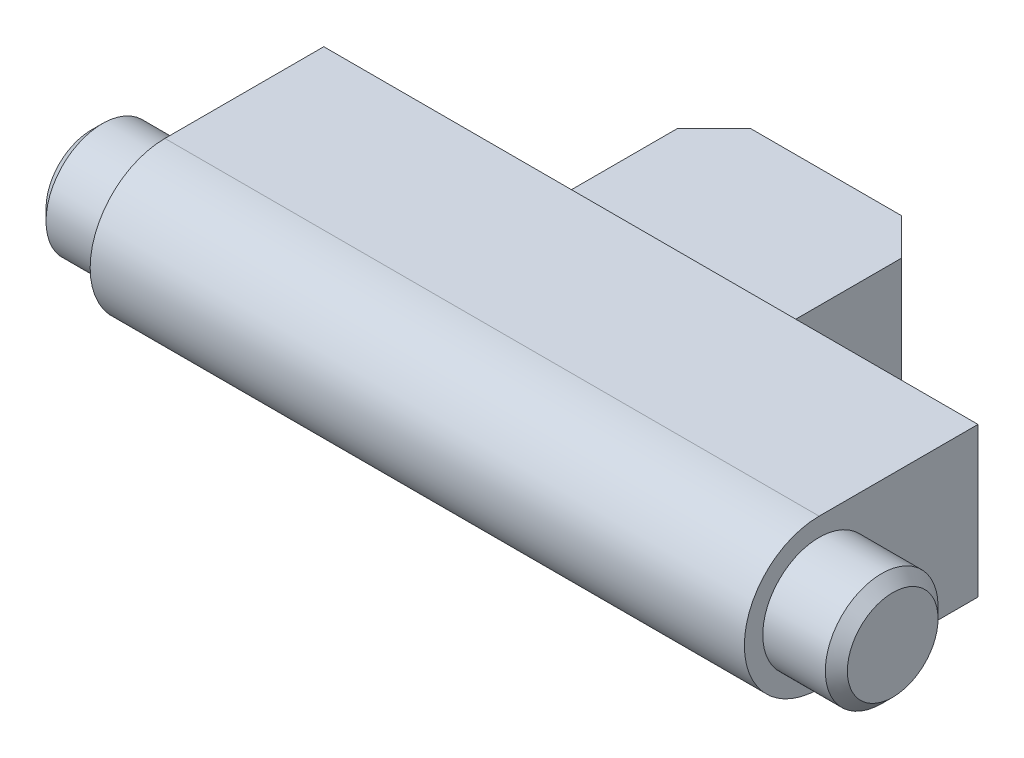
ISO-10303-21;
HEADER;
FILE_DESCRIPTION(('STEP AP214'),'2;1');
FILE_NAME('part.step','',(''),(''),'','','');
FILE_SCHEMA(('AUTOMOTIVE_DESIGN { 1 0 10303 214 1 1 1 1 }'));
ENDSEC;
DATA;
#1=APPLICATION_CONTEXT('core data for automotive mechanical design processes');
#2=APPLICATION_PROTOCOL_DEFINITION('international standard','automotive_design',2000,#1);
#3=PRODUCT_CONTEXT('',#1,'mechanical');
#4=PRODUCT('Part','Part','',(#3));
#5=PRODUCT_RELATED_PRODUCT_CATEGORY('part','',(#4));
#6=PRODUCT_DEFINITION_FORMATION('','',#4);
#7=PRODUCT_DEFINITION_CONTEXT('part definition',#1,'design');
#8=PRODUCT_DEFINITION('design','',#6,#7);
#9=PRODUCT_DEFINITION_SHAPE('','',#8);
#10=(LENGTH_UNIT() NAMED_UNIT(*) SI_UNIT(.MILLI.,.METRE.));
#11=(NAMED_UNIT(*) PLANE_ANGLE_UNIT() SI_UNIT($,.RADIAN.));
#12=(NAMED_UNIT(*) SI_UNIT($,.STERADIAN.) SOLID_ANGLE_UNIT());
#13=UNCERTAINTY_MEASURE_WITH_UNIT(LENGTH_MEASURE(1.E-05),#10,'distance_accuracy_value','');
#14=(GEOMETRIC_REPRESENTATION_CONTEXT(3) GLOBAL_UNCERTAINTY_ASSIGNED_CONTEXT((#13)) GLOBAL_UNIT_ASSIGNED_CONTEXT((#10,
#11,#12)) REPRESENTATION_CONTEXT('',''));
#15=CARTESIAN_POINT('',(0.,0.,0.));
#16=DIRECTION('',(0.,0.,1.));
#17=DIRECTION('',(1.,0.,0.));
#18=AXIS2_PLACEMENT_3D('',#15,#16,#17);
#19=CARTESIAN_POINT('',(0.,0.,0.));
#20=DIRECTION('',(0.,0.,-1.));
#21=DIRECTION('',(-1.,0.,0.));
#22=AXIS2_PLACEMENT_3D('',#19,#20,#21);
#23=PLANE('',#22);
#24=DIRECTION('',(0.,1.,0.));
#25=VECTOR('',#24,1.);
#26=CARTESIAN_POINT('',(-3507.0194796416,498.462300000025,0.));
#27=LINE('',#26,#25);
#28=CARTESIAN_POINT('',(-3507.0194796416,498.335300000025,0.));
#29=VERTEX_POINT('',#28);
#30=CARTESIAN_POINT('',(-3507.0194796416,501.510300000025,0.));
#31=VERTEX_POINT('',#30);
#32=EDGE_CURVE('E123',#29,#31,#27,.T.);
#33=ORIENTED_EDGE('',*,*,#32,.F.);
#34=DIRECTION('',(1.,0.,0.));
#35=VECTOR('',#34,1.);
#36=CARTESIAN_POINT('',(-3512.8614796416,498.335300000025,0.));
#37=LINE('',#36,#35);
#38=CARTESIAN_POINT('',(-3512.8614796416,498.335300000025,0.));
#39=VERTEX_POINT('',#38);
#40=EDGE_CURVE('E136',#39,#29,#37,.T.);
#41=ORIENTED_EDGE('',*,*,#40,.F.);
#42=DIRECTION('',(0.,-1.,0.));
#43=VECTOR('',#42,1.);
#44=CARTESIAN_POINT('',(-3512.8614796416,498.335300000025,0.));
#45=LINE('',#44,#43);
#46=CARTESIAN_POINT('',(-3512.8614796416,502.399300000025,0.));
#47=VERTEX_POINT('',#46);
#48=EDGE_CURVE('E137',#47,#39,#45,.T.);
#49=ORIENTED_EDGE('',*,*,#48,.F.);
#50=DIRECTION('',(-1.,0.,0.));
#51=VECTOR('',#50,1.);
#52=CARTESIAN_POINT('',(-3512.8614796416,502.399300000025,0.));
#53=LINE('',#52,#51);
#54=CARTESIAN_POINT('',(-3495.0814796416,502.399300000025,0.));
#55=VERTEX_POINT('',#54);
#56=EDGE_CURVE('E142',#55,#47,#53,.T.);
#57=ORIENTED_EDGE('',*,*,#56,.F.);
#58=DIRECTION('',(0.,1.,0.));
#59=VECTOR('',#58,1.);
#60=CARTESIAN_POINT('',(-3495.0814796416,498.335300000025,0.));
#61=LINE('',#60,#59);
#62=CARTESIAN_POINT('',(-3495.0814796416,498.335300000025,0.));
#63=VERTEX_POINT('',#62);
#64=EDGE_CURVE('E135',#63,#55,#61,.T.);
#65=ORIENTED_EDGE('',*,*,#64,.F.);
#66=CARTESIAN_POINT('',(-3500.9234796416,498.335300000025,0.));
#67=VERTEX_POINT('',#66);
#68=EDGE_CURVE('E127',#67,#63,#37,.T.);
#69=ORIENTED_EDGE('',*,*,#68,.F.);
#70=DIRECTION('',(0.,-1.,0.));
#71=VECTOR('',#70,1.);
#72=CARTESIAN_POINT('',(-3500.9234796416,501.510300000025,0.));
#73=LINE('',#72,#71);
#74=CARTESIAN_POINT('',(-3500.9234796416,501.510300000025,0.));
#75=VERTEX_POINT('',#74);
#76=EDGE_CURVE('E113',#75,#67,#73,.T.);
#77=ORIENTED_EDGE('',*,*,#76,.F.);
#78=DIRECTION('',(1.,0.,0.));
#79=VECTOR('',#78,1.);
#80=CARTESIAN_POINT('',(-3507.0194796416,501.510300000025,0.));
#81=LINE('',#80,#79);
#82=EDGE_CURVE('E420',#31,#75,#81,.T.);
#83=ORIENTED_EDGE('',*,*,#82,.F.);
#84=EDGE_LOOP('',(#33,#41,#49,#57,#65,#69,#77,#83));
#85=FACE_BOUND('',#84,.T.);
#86=ADVANCED_FACE('F35',(#85),#23,.T.);
#87=CARTESIAN_POINT('',(-3512.8614796416,500.367300000025,4.31800000000002));
#88=DIRECTION('',(-1.,0.,0.));
#89=DIRECTION('',(0.,0.,1.));
#90=AXIS2_PLACEMENT_3D('',#87,#88,#89);
#91=CYLINDRICAL_SURFACE('',#90,2.03199999999996);
#92=DIRECTION('',(-1.,0.,0.));
#93=VECTOR('',#92,1.);
#94=CARTESIAN_POINT('',(-3512.8614796416,502.399300000025,4.31800000000002));
#95=LINE('',#94,#93);
#96=CARTESIAN_POINT('',(-3512.8614796416,502.399300000025,4.31800000000002));
#97=VERTEX_POINT('',#96);
#98=CARTESIAN_POINT('',(-3495.0814796416,502.399300000025,4.31800000000002));
#99=VERTEX_POINT('',#98);
#100=EDGE_CURVE('E153',#97,#99,#95,.F.);
#101=ORIENTED_EDGE('',*,*,#100,.F.);
#102=CARTESIAN_POINT('',(-3512.8614796416,500.367300000025,4.31800000000002));
#103=DIRECTION('',(1.,0.,0.));
#104=DIRECTION('',(0.,0.,-1.));
#105=AXIS2_PLACEMENT_3D('',#102,#103,#104);
#106=CIRCLE('',#105,2.03199999999996);
#107=CARTESIAN_POINT('',(-3512.8614796416,498.335300000025,4.31800000000008));
#108=VERTEX_POINT('',#107);
#109=EDGE_CURVE('E159',#108,#97,#106,.F.);
#110=ORIENTED_EDGE('',*,*,#109,.F.);
#111=DIRECTION('',(-1.,0.,0.));
#112=VECTOR('',#111,1.);
#113=CARTESIAN_POINT('',(-3512.8614796416,498.335300000025,4.31800000000002));
#114=LINE('',#113,#112);
#115=CARTESIAN_POINT('',(-3495.0814796416,498.335300000025,4.31800000000008));
#116=VERTEX_POINT('',#115);
#117=EDGE_CURVE('E156',#116,#108,#114,.T.);
#118=ORIENTED_EDGE('',*,*,#117,.F.);
#119=CARTESIAN_POINT('',(-3495.0814796416,500.367300000025,4.31800000000002));
#120=DIRECTION('',(-1.,0.,0.));
#121=DIRECTION('',(0.,0.,1.));
#122=AXIS2_PLACEMENT_3D('',#119,#120,#121);
#123=CIRCLE('',#122,2.03199999999996);
#124=EDGE_CURVE('E161',#99,#116,#123,.F.);
#125=ORIENTED_EDGE('',*,*,#124,.F.);
#126=EDGE_LOOP('',(#101,#110,#118,#125));
#127=FACE_BOUND('',#126,.T.);
#128=ADVANCED_FACE('F227',(#127),#91,.T.);
#129=CARTESIAN_POINT('',(-3495.0814796416,498.335300000025,6.35));
#130=DIRECTION('',(-1.,0.,0.));
#131=DIRECTION('',(0.,0.,1.));
#132=AXIS2_PLACEMENT_3D('',#129,#130,#131);
#133=PLANE('',#132);
#134=CARTESIAN_POINT('',(-3495.08147964159,500.367300000025,4.31800000000002));
#135=DIRECTION('',(-1.,0.,0.));
#136=DIRECTION('',(0.,-1.,0.));
#137=AXIS2_PLACEMENT_3D('',#134,#135,#136);
#138=CIRCLE('',#137,1.53199999999989);
#139=CARTESIAN_POINT('',(-3495.08147964159,498.835300000025,4.31800000000002));
#140=VERTEX_POINT('',#139);
#141=EDGE_CURVE('E207',#140,#140,#138,.T.);
#142=ORIENTED_EDGE('',*,*,#141,.T.);
#143=EDGE_LOOP('',(#142));
#144=FACE_BOUND('',#143,.T.);
#145=DIRECTION('',(0.,0.,-1.));
#146=VECTOR('',#145,1.);
#147=CARTESIAN_POINT('',(-3495.0814796416,502.399300000025,6.35));
#148=LINE('',#147,#146);
#149=EDGE_CURVE('E151',#99,#55,#148,.T.);
#150=ORIENTED_EDGE('',*,*,#149,.F.);
#151=ORIENTED_EDGE('',*,*,#124,.T.);
#152=DIRECTION('',(0.,0.,-1.));
#153=VECTOR('',#152,1.);
#154=CARTESIAN_POINT('',(-3495.0814796416,498.335300000025,6.35));
#155=LINE('',#154,#153);
#156=EDGE_CURVE('E140',#116,#63,#155,.T.);
#157=ORIENTED_EDGE('',*,*,#156,.T.);
#158=ORIENTED_EDGE('',*,*,#64,.T.);
#159=EDGE_LOOP('',(#150,#151,#157,#158));
#160=FACE_BOUND('',#159,.T.);
#161=ADVANCED_FACE('F229',(#144,#160),#133,.F.);
#162=CARTESIAN_POINT('',(-3512.8614796416,502.399300000025,6.35));
#163=DIRECTION('',(0.,-1.,0.));
#164=DIRECTION('',(0.,0.,-1.));
#165=AXIS2_PLACEMENT_3D('',#162,#163,#164);
#166=PLANE('',#165);
#167=DIRECTION('',(0.,0.,-1.));
#168=VECTOR('',#167,1.);
#169=CARTESIAN_POINT('',(-3512.8614796416,502.399300000025,6.35));
#170=LINE('',#169,#168);
#171=EDGE_CURVE('E149',#97,#47,#170,.T.);
#172=ORIENTED_EDGE('',*,*,#171,.F.);
#173=ORIENTED_EDGE('',*,*,#100,.T.);
#174=ORIENTED_EDGE('',*,*,#149,.T.);
#175=ORIENTED_EDGE('',*,*,#56,.T.);
#176=EDGE_LOOP('',(#172,#173,#174,#175));
#177=FACE_BOUND('',#176,.T.);
#178=ADVANCED_FACE('F218',(#177),#166,.F.);
#179=CARTESIAN_POINT('',(-3512.8614796416,498.335300000025,6.35));
#180=DIRECTION('',(1.,0.,0.));
#181=DIRECTION('',(0.,0.,-1.));
#182=AXIS2_PLACEMENT_3D('',#179,#180,#181);
#183=PLANE('',#182);
#184=CARTESIAN_POINT('',(-3512.8614796416,500.367300000025,4.31800000000002));
#185=DIRECTION('',(1.,0.,0.));
#186=DIRECTION('',(0.,0.,-1.));
#187=AXIS2_PLACEMENT_3D('',#184,#185,#186);
#188=CIRCLE('',#187,1.53199999999989);
#189=CARTESIAN_POINT('',(-3512.8614796416,500.367300000025,2.78600000000013));
#190=VERTEX_POINT('',#189);
#191=EDGE_CURVE('E163',#190,#190,#188,.F.);
#192=ORIENTED_EDGE('',*,*,#191,.F.);
#193=EDGE_LOOP('',(#192));
#194=FACE_BOUND('',#193,.T.);
#195=DIRECTION('',(0.,0.,-1.));
#196=VECTOR('',#195,1.);
#197=CARTESIAN_POINT('',(-3512.8614796416,498.335300000025,6.35));
#198=LINE('',#197,#196);
#199=EDGE_CURVE('E147',#108,#39,#198,.T.);
#200=ORIENTED_EDGE('',*,*,#199,.F.);
#201=ORIENTED_EDGE('',*,*,#109,.T.);
#202=ORIENTED_EDGE('',*,*,#171,.T.);
#203=ORIENTED_EDGE('',*,*,#48,.T.);
#204=EDGE_LOOP('',(#200,#201,#202,#203));
#205=FACE_BOUND('',#204,.T.);
#206=ADVANCED_FACE('F223',(#194,#205),#183,.F.);
#207=CARTESIAN_POINT('',(-3512.8614796416,498.335300000025,6.35));
#208=DIRECTION('',(0.,1.,0.));
#209=DIRECTION('',(0.,0.,1.));
#210=AXIS2_PLACEMENT_3D('',#207,#208,#209);
#211=PLANE('',#210);
#212=DIRECTION('',(0.,0.,1.));
#213=VECTOR('',#212,1.);
#214=CARTESIAN_POINT('',(-3507.0194796416,498.335300000025,0.));
#215=LINE('',#214,#213);
#216=CARTESIAN_POINT('',(-3507.0194796416,498.335300000025,-3.76249999999992));
#217=VERTEX_POINT('',#216);
#218=EDGE_CURVE('E129',#217,#29,#215,.T.);
#219=ORIENTED_EDGE('',*,*,#218,.F.);
#220=DIRECTION('',(0.707106781186481,0.,-0.707106781186614));
#221=VECTOR('',#220,1.);
#222=CARTESIAN_POINT('',(-3506.0194796416,498.335300000025,-4.7625));
#223=LINE('',#222,#221);
#224=CARTESIAN_POINT('',(-3506.0194796416,498.335300000025,-4.7625));
#225=VERTEX_POINT('',#224);
#226=EDGE_CURVE('E44',#217,#225,#223,.T.);
#227=ORIENTED_EDGE('',*,*,#226,.T.);
#228=DIRECTION('',(-1.,0.,0.));
#229=VECTOR('',#228,1.);
#230=CARTESIAN_POINT('',(-3507.0194796416,498.335300000025,-4.7625));
#231=LINE('',#230,#229);
#232=CARTESIAN_POINT('',(-3501.9234796416,498.335300000025,-4.7625));
#233=VERTEX_POINT('',#232);
#234=EDGE_CURVE('E191',#233,#225,#231,.T.);
#235=ORIENTED_EDGE('',*,*,#234,.F.);
#236=DIRECTION('',(0.707106781186481,0.,0.707106781186614));
#237=VECTOR('',#236,1.);
#238=CARTESIAN_POINT('',(-3501.9234796416,498.335300000025,-4.7625));
#239=LINE('',#238,#237);
#240=CARTESIAN_POINT('',(-3500.9234796416,498.335300000025,-3.76249999999992));
#241=VERTEX_POINT('',#240);
#242=EDGE_CURVE('E51',#233,#241,#239,.T.);
#243=ORIENTED_EDGE('',*,*,#242,.T.);
#244=DIRECTION('',(0.,0.,-1.));
#245=VECTOR('',#244,1.);
#246=CARTESIAN_POINT('',(-3500.9234796416,498.335300000025,-4.7625));
#247=LINE('',#246,#245);
#248=EDGE_CURVE('E115',#67,#241,#247,.T.);
#249=ORIENTED_EDGE('',*,*,#248,.F.);
#250=ORIENTED_EDGE('',*,*,#68,.T.);
#251=ORIENTED_EDGE('',*,*,#156,.F.);
#252=ORIENTED_EDGE('',*,*,#117,.T.);
#253=ORIENTED_EDGE('',*,*,#199,.T.);
#254=ORIENTED_EDGE('',*,*,#40,.T.);
#255=EDGE_LOOP('',(#219,#227,#235,#243,#249,#250,#251,#252,#253,#254));
#256=FACE_BOUND('',#255,.T.);
#257=ADVANCED_FACE('F125',(#256),#211,.F.);
#258=CARTESIAN_POINT('',(-3514.86147964161,500.367300000025,4.31800000000002));
#259=DIRECTION('',(1.,0.,0.));
#260=DIRECTION('',(0.,1.,0.));
#261=AXIS2_PLACEMENT_3D('',#258,#259,#260);
#262=CYLINDRICAL_SURFACE('',#261,1.53199999999989);
#263=CARTESIAN_POINT('',(-3514.56147964161,500.367300000025,4.31800000000002));
#264=DIRECTION('',(-1.,0.,0.));
#265=DIRECTION('',(0.,0.,1.));
#266=AXIS2_PLACEMENT_3D('',#263,#264,#265);
#267=CIRCLE('',#266,1.53199999999989);
#268=CARTESIAN_POINT('',(-3514.56147964161,500.367300000025,5.84999999999991));
#269=VERTEX_POINT('',#268);
#270=EDGE_CURVE('E169',#269,#269,#267,.F.);
#271=ORIENTED_EDGE('',*,*,#270,.T.);
#272=EDGE_LOOP('',(#271));
#273=FACE_BOUND('',#272,.T.);
#274=ORIENTED_EDGE('',*,*,#191,.T.);
#275=EDGE_LOOP('',(#274));
#276=FACE_BOUND('',#275,.T.);
#277=ADVANCED_FACE('F245',(#273,#276),#262,.T.);
#278=CARTESIAN_POINT('',(-3514.86147964161,500.367300000025,4.31800000000002));
#279=DIRECTION('',(-1.,0.,0.));
#280=DIRECTION('',(0.,-1.,0.));
#281=AXIS2_PLACEMENT_3D('',#278,#279,#280);
#282=PLANE('',#281);
#283=CARTESIAN_POINT('',(-3514.86147964161,500.367300000025,4.31800000000002));
#284=DIRECTION('',(-1.,0.,0.));
#285=DIRECTION('',(0.,-1.,0.));
#286=AXIS2_PLACEMENT_3D('',#283,#284,#285);
#287=CIRCLE('',#286,1.2319999999994);
#288=CARTESIAN_POINT('',(-3514.86147964161,499.135300000025,4.31800000000002));
#289=VERTEX_POINT('',#288);
#290=EDGE_CURVE('E166',#289,#289,#287,.T.);
#291=ORIENTED_EDGE('',*,*,#290,.T.);
#292=EDGE_LOOP('',(#291));
#293=FACE_BOUND('',#292,.T.);
#294=ADVANCED_FACE('F256',(#293),#282,.T.);
#295=CARTESIAN_POINT('',(-3514.86147964161,500.367300000025,4.31800000000002));
#296=DIRECTION('',(1.,0.,0.));
#297=DIRECTION('',(0.,0.,-1.));
#298=AXIS2_PLACEMENT_3D('',#295,#296,#297);
#299=CONICAL_SURFACE('',#298,1.23199999999934,0.785398163397306);
#300=ORIENTED_EDGE('',*,*,#270,.F.);
#301=EDGE_LOOP('',(#300));
#302=FACE_BOUND('',#301,.T.);
#303=ORIENTED_EDGE('',*,*,#290,.F.);
#304=EDGE_LOOP('',(#303));
#305=FACE_BOUND('',#304,.T.);
#306=ADVANCED_FACE('F261',(#302,#305),#299,.T.);
#307=CARTESIAN_POINT('',(-3493.08147964159,500.367300000025,4.31800000000002));
#308=DIRECTION('',(-1.,0.,0.));
#309=DIRECTION('',(0.,-1.,0.));
#310=AXIS2_PLACEMENT_3D('',#307,#308,#309);
#311=CYLINDRICAL_SURFACE('',#310,1.53199999999989);
#312=CARTESIAN_POINT('',(-3493.38147964159,500.367300000025,4.31800000000002));
#313=DIRECTION('',(1.,0.,0.));
#314=DIRECTION('',(0.,0.,-1.));
#315=AXIS2_PLACEMENT_3D('',#312,#313,#314);
#316=CIRCLE('',#315,1.53199999999989);
#317=CARTESIAN_POINT('',(-3493.38147964159,500.367300000025,2.78600000000013));
#318=VERTEX_POINT('',#317);
#319=EDGE_CURVE('E172',#318,#318,#316,.F.);
#320=ORIENTED_EDGE('',*,*,#319,.T.);
#321=EDGE_LOOP('',(#320));
#322=FACE_BOUND('',#321,.T.);
#323=ORIENTED_EDGE('',*,*,#141,.F.);
#324=EDGE_LOOP('',(#323));
#325=FACE_BOUND('',#324,.T.);
#326=ADVANCED_FACE('F267',(#322,#325),#311,.T.);
#327=CARTESIAN_POINT('',(-3493.08147964159,500.367300000025,4.31800000000002));
#328=DIRECTION('',(1.,0.,0.));
#329=DIRECTION('',(0.,-1.,0.));
#330=AXIS2_PLACEMENT_3D('',#327,#328,#329);
#331=PLANE('',#330);
#332=CARTESIAN_POINT('',(-3493.08147964159,500.367300000025,4.31800000000002));
#333=DIRECTION('',(1.,0.,0.));
#334=DIRECTION('',(0.,1.,0.));
#335=AXIS2_PLACEMENT_3D('',#332,#333,#334);
#336=CIRCLE('',#335,1.23199999999962);
#337=CARTESIAN_POINT('',(-3493.08147964159,501.599300000024,4.31800000000002));
#338=VERTEX_POINT('',#337);
#339=EDGE_CURVE('E175',#338,#338,#336,.T.);
#340=ORIENTED_EDGE('',*,*,#339,.T.);
#341=EDGE_LOOP('',(#340));
#342=FACE_BOUND('',#341,.T.);
#343=ADVANCED_FACE('F273',(#342),#331,.T.);
#344=CARTESIAN_POINT('',(-3493.38147964159,500.367300000025,4.31800000000002));
#345=DIRECTION('',(-1.,0.,0.));
#346=DIRECTION('',(0.,0.,1.));
#347=AXIS2_PLACEMENT_3D('',#344,#345,#346);
#348=CONICAL_SURFACE('',#347,1.53199999999989,0.785398163397676);
#349=ORIENTED_EDGE('',*,*,#339,.F.);
#350=EDGE_LOOP('',(#349));
#351=FACE_BOUND('',#350,.T.);
#352=ORIENTED_EDGE('',*,*,#319,.F.);
#353=EDGE_LOOP('',(#352));
#354=FACE_BOUND('',#353,.T.);
#355=ADVANCED_FACE('F282',(#351,#354),#348,.T.);
#356=CARTESIAN_POINT('',(-3500.9234796416,501.510300000025,-4.7625));
#357=DIRECTION('',(-1.,0.,0.));
#358=DIRECTION('',(0.,0.,1.));
#359=AXIS2_PLACEMENT_3D('',#356,#357,#358);
#360=PLANE('',#359);
#361=ORIENTED_EDGE('',*,*,#248,.T.);
#362=DIRECTION('',(0.,1.,0.));
#363=VECTOR('',#362,1.);
#364=CARTESIAN_POINT('',(-3500.9234796416,501.510300000025,-3.76249999999992));
#365=LINE('',#364,#363);
#366=CARTESIAN_POINT('',(-3500.9234796416,501.510300000025,-3.76249999999992));
#367=VERTEX_POINT('',#366);
#368=EDGE_CURVE('E11',#241,#367,#365,.T.);
#369=ORIENTED_EDGE('',*,*,#368,.T.);
#370=DIRECTION('',(0.,0.,1.));
#371=VECTOR('',#370,1.);
#372=CARTESIAN_POINT('',(-3500.9234796416,501.510300000025,-4.7625));
#373=LINE('',#372,#371);
#374=EDGE_CURVE('E118',#367,#75,#373,.T.);
#375=ORIENTED_EDGE('',*,*,#374,.T.);
#376=ORIENTED_EDGE('',*,*,#76,.T.);
#377=EDGE_LOOP('',(#361,#369,#375,#376));
#378=FACE_BOUND('',#377,.T.);
#379=ADVANCED_FACE('F114',(#378),#360,.F.);
#380=CARTESIAN_POINT('',(-3507.0194796416,498.462300000025,-4.7625));
#381=DIRECTION('',(1.,0.,0.));
#382=DIRECTION('',(0.,0.,-1.));
#383=AXIS2_PLACEMENT_3D('',#380,#381,#382);
#384=PLANE('',#383);
#385=DIRECTION('',(0.,0.,1.));
#386=VECTOR('',#385,1.);
#387=CARTESIAN_POINT('',(-3507.0194796416,501.510300000025,-4.7625));
#388=LINE('',#387,#386);
#389=CARTESIAN_POINT('',(-3507.0194796416,501.510300000025,-3.76249999999992));
#390=VERTEX_POINT('',#389);
#391=EDGE_CURVE('E203',#390,#31,#388,.T.);
#392=ORIENTED_EDGE('',*,*,#391,.F.);
#393=DIRECTION('',(0.,-1.,0.));
#394=VECTOR('',#393,1.);
#395=CARTESIAN_POINT('',(-3507.0194796416,498.335300000025,-3.76249999999992));
#396=LINE('',#395,#394);
#397=EDGE_CURVE('E59',#390,#217,#396,.T.);
#398=ORIENTED_EDGE('',*,*,#397,.T.);
#399=ORIENTED_EDGE('',*,*,#218,.T.);
#400=ORIENTED_EDGE('',*,*,#32,.T.);
#401=EDGE_LOOP('',(#392,#398,#399,#400));
#402=FACE_BOUND('',#401,.T.);
#403=ADVANCED_FACE('F206',(#402),#384,.F.);
#404=CARTESIAN_POINT('',(-3507.0194796416,501.510300000025,-4.7625));
#405=DIRECTION('',(0.,-1.,0.));
#406=DIRECTION('',(0.,0.,-1.));
#407=AXIS2_PLACEMENT_3D('',#404,#405,#406);
#408=PLANE('',#407);
#409=DIRECTION('',(1.,0.,0.));
#410=VECTOR('',#409,1.);
#411=CARTESIAN_POINT('',(-3507.0194796416,501.510300000025,-4.7625));
#412=LINE('',#411,#410);
#413=CARTESIAN_POINT('',(-3506.0194796416,501.510300000025,-4.7625));
#414=VERTEX_POINT('',#413);
#415=CARTESIAN_POINT('',(-3501.9234796416,501.510300000025,-4.7625));
#416=VERTEX_POINT('',#415);
#417=EDGE_CURVE('E204',#414,#416,#412,.T.);
#418=ORIENTED_EDGE('',*,*,#417,.F.);
#419=DIRECTION('',(-0.707106781186481,0.,0.707106781186614));
#420=VECTOR('',#419,1.);
#421=CARTESIAN_POINT('',(-3506.0194796416,501.510300000025,-4.7625));
#422=LINE('',#421,#420);
#423=EDGE_CURVE('E186',#414,#390,#422,.T.);
#424=ORIENTED_EDGE('',*,*,#423,.T.);
#425=ORIENTED_EDGE('',*,*,#391,.T.);
#426=ORIENTED_EDGE('',*,*,#82,.T.);
#427=ORIENTED_EDGE('',*,*,#374,.F.);
#428=DIRECTION('',(-0.707106781186481,0.,-0.707106781186614));
#429=VECTOR('',#428,1.);
#430=CARTESIAN_POINT('',(-3501.9234796416,501.510300000025,-4.7625));
#431=LINE('',#430,#429);
#432=EDGE_CURVE('E184',#367,#416,#431,.T.);
#433=ORIENTED_EDGE('',*,*,#432,.T.);
#434=EDGE_LOOP('',(#418,#424,#425,#426,#427,#433));
#435=FACE_BOUND('',#434,.T.);
#436=ADVANCED_FACE('F202',(#435),#408,.F.);
#437=CARTESIAN_POINT('',(0.,0.,-4.7625));
#438=DIRECTION('',(0.,0.,-1.));
#439=DIRECTION('',(-1.,0.,0.));
#440=AXIS2_PLACEMENT_3D('',#437,#438,#439);
#441=PLANE('',#440);
#442=ORIENTED_EDGE('',*,*,#234,.T.);
#443=DIRECTION('',(0.,1.,0.));
#444=VECTOR('',#443,1.);
#445=CARTESIAN_POINT('',(-3506.0194796416,501.510300000025,-4.7625));
#446=LINE('',#445,#444);
#447=EDGE_CURVE('E181',#225,#414,#446,.T.);
#448=ORIENTED_EDGE('',*,*,#447,.T.);
#449=ORIENTED_EDGE('',*,*,#417,.T.);
#450=DIRECTION('',(0.,-1.,0.));
#451=VECTOR('',#450,1.);
#452=CARTESIAN_POINT('',(-3501.9234796416,498.335300000025,-4.7625));
#453=LINE('',#452,#451);
#454=EDGE_CURVE('E178',#416,#233,#453,.T.);
#455=ORIENTED_EDGE('',*,*,#454,.T.);
#456=EDGE_LOOP('',(#442,#448,#449,#455));
#457=FACE_BOUND('',#456,.T.);
#458=ADVANCED_FACE('F195',(#457),#441,.T.);
#459=CARTESIAN_POINT('',(-3506.0194796416,0.,-4.7625));
#460=DIRECTION('',(-0.707106781186614,0.,-0.707106781186481));
#461=DIRECTION('',(0.,-1.,0.));
#462=AXIS2_PLACEMENT_3D('',#459,#460,#461);
#463=PLANE('',#462);
#464=ORIENTED_EDGE('',*,*,#226,.F.);
#465=ORIENTED_EDGE('',*,*,#397,.F.);
#466=ORIENTED_EDGE('',*,*,#423,.F.);
#467=ORIENTED_EDGE('',*,*,#447,.F.);
#468=EDGE_LOOP('',(#464,#465,#466,#467));
#469=FACE_BOUND('',#468,.T.);
#470=ADVANCED_FACE('F200',(#469),#463,.T.);
#471=CARTESIAN_POINT('',(-3501.9234796416,0.,-4.7625));
#472=DIRECTION('',(0.707106781186614,0.,-0.707106781186481));
#473=DIRECTION('',(0.,1.,0.));
#474=AXIS2_PLACEMENT_3D('',#471,#472,#473);
#475=PLANE('',#474);
#476=ORIENTED_EDGE('',*,*,#432,.F.);
#477=ORIENTED_EDGE('',*,*,#368,.F.);
#478=ORIENTED_EDGE('',*,*,#242,.F.);
#479=ORIENTED_EDGE('',*,*,#454,.F.);
#480=EDGE_LOOP('',(#476,#477,#478,#479));
#481=FACE_BOUND('',#480,.T.);
#482=ADVANCED_FACE('F38',(#481),#475,.T.);
#483=CLOSED_SHELL('',(#86,#128,#161,#178,#206,#257,#277,#294,#306,#326,#343,#355,#379,#403,#436,
#458,#470,#482));
#484=MANIFOLD_SOLID_BREP('B2',#483);
#485=ADVANCED_BREP_SHAPE_REPRESENTATION('',(#18,#484),#14);
#486=SHAPE_DEFINITION_REPRESENTATION(#9,#485);
ENDSEC;
END-ISO-10303-21;
